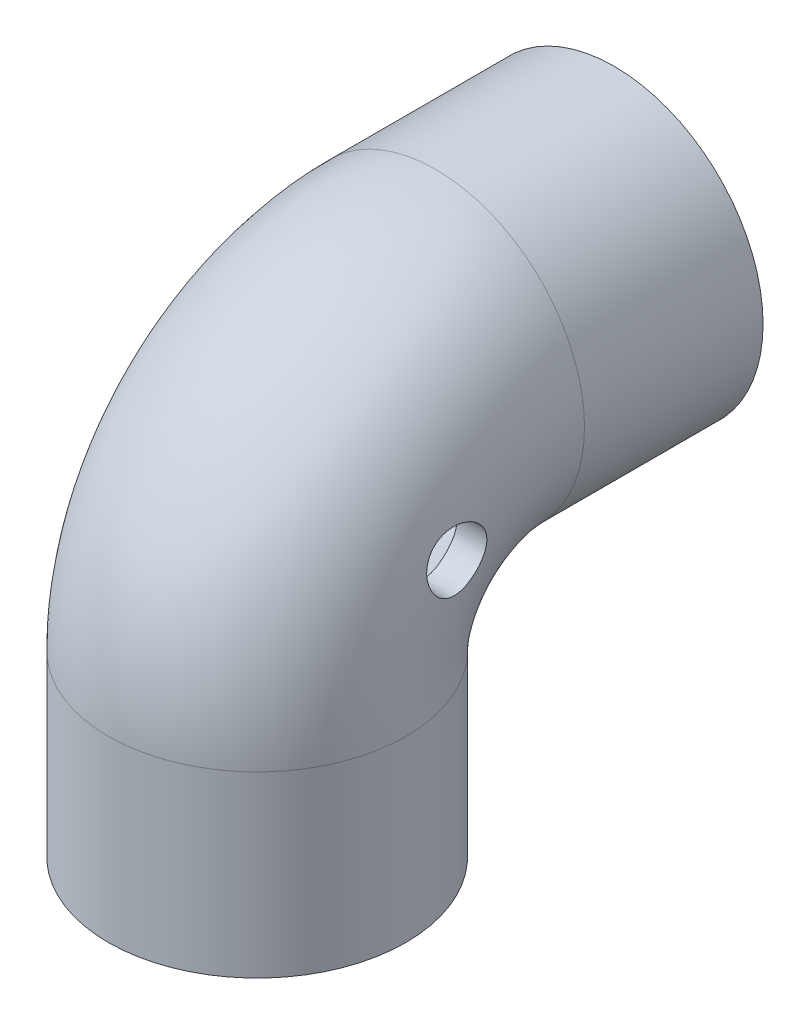
ISO-10303-21;
HEADER;
FILE_DESCRIPTION(('STEP AP214'),'2;1');
FILE_NAME('part.step','',(''),(''),'','','');
FILE_SCHEMA(('AUTOMOTIVE_DESIGN { 1 0 10303 214 1 1 1 1 }'));
ENDSEC;
DATA;
#1=APPLICATION_CONTEXT('core data for automotive mechanical design processes');
#2=APPLICATION_PROTOCOL_DEFINITION('international standard','automotive_design',2000,#1);
#3=PRODUCT_CONTEXT('',#1,'mechanical');
#4=PRODUCT('Part','Part','',(#3));
#5=PRODUCT_RELATED_PRODUCT_CATEGORY('part','',(#4));
#6=PRODUCT_DEFINITION_FORMATION('','',#4);
#7=PRODUCT_DEFINITION_CONTEXT('part definition',#1,'design');
#8=PRODUCT_DEFINITION('design','',#6,#7);
#9=PRODUCT_DEFINITION_SHAPE('','',#8);
#10=(LENGTH_UNIT() NAMED_UNIT(*) SI_UNIT(.MILLI.,.METRE.));
#11=(NAMED_UNIT(*) PLANE_ANGLE_UNIT() SI_UNIT($,.RADIAN.));
#12=(NAMED_UNIT(*) SI_UNIT($,.STERADIAN.) SOLID_ANGLE_UNIT());
#13=UNCERTAINTY_MEASURE_WITH_UNIT(LENGTH_MEASURE(1.E-05),#10,'distance_accuracy_value','');
#14=(GEOMETRIC_REPRESENTATION_CONTEXT(3) GLOBAL_UNCERTAINTY_ASSIGNED_CONTEXT((#13)) GLOBAL_UNIT_ASSIGNED_CONTEXT((#10,
#11,#12)) REPRESENTATION_CONTEXT('',''));
#15=CARTESIAN_POINT('',(0.,0.,0.));
#16=DIRECTION('',(0.,0.,1.));
#17=DIRECTION('',(1.,0.,0.));
#18=AXIS2_PLACEMENT_3D('',#15,#16,#17);
#19=CARTESIAN_POINT('',(0.,0.,0.));
#20=DIRECTION('',(0.,1.,0.));
#21=DIRECTION('',(0.,0.,1.));
#22=AXIS2_PLACEMENT_3D('',#19,#20,#21);
#23=CYLINDRICAL_SURFACE('',#22,12.5);
#24=CARTESIAN_POINT('',(0.,14.9999999999999,0.));
#25=DIRECTION('',(0.,1.,0.));
#26=DIRECTION('',(0.,0.,1.));
#27=AXIS2_PLACEMENT_3D('',#24,#25,#26);
#28=CIRCLE('',#27,12.5);
#29=CARTESIAN_POINT('',(0.,14.9999999999999,12.5));
#30=VERTEX_POINT('',#29);
#31=EDGE_CURVE('E98',#30,#30,#28,.T.);
#32=ORIENTED_EDGE('',*,*,#31,.F.);
#33=EDGE_LOOP('',(#32));
#34=FACE_BOUND('',#33,.T.);
#35=CARTESIAN_POINT('',(0.,0.,0.));
#36=DIRECTION('',(0.,1.,0.));
#37=DIRECTION('',(0.,0.,1.));
#38=AXIS2_PLACEMENT_3D('',#35,#36,#37);
#39=CIRCLE('',#38,12.5);
#40=CARTESIAN_POINT('',(0.,0.,12.5));
#41=VERTEX_POINT('',#40);
#42=EDGE_CURVE('E60',#41,#41,#39,.T.);
#43=ORIENTED_EDGE('',*,*,#42,.T.);
#44=EDGE_LOOP('',(#43));
#45=FACE_BOUND('',#44,.T.);
#46=ADVANCED_FACE('F39',(#34,#45),#23,.T.);
#47=CARTESIAN_POINT('',(0.,15.,-15.));
#48=DIRECTION('',(-1.,0.,0.));
#49=DIRECTION('',(0.,0.,1.));
#50=AXIS2_PLACEMENT_3D('',#47,#48,#49);
#51=TOROIDAL_SURFACE('',#50,15.,12.5);
#52=CARTESIAN_POINT('',(-12.2581101899307,24.2005987948516,-6.46055956779744));
#53=CARTESIAN_POINT('',(-12.2519989551284,24.0872564443121,-6.38346281613475));
#54=CARTESIAN_POINT('',(-12.2484072995002,23.9801301236395,-6.29692574651522));
#55=CARTESIAN_POINT('',(-12.246827231077,23.7814678897547,-6.1073865438133));
#56=CARTESIAN_POINT('',(-12.2488419440933,23.6899407039752,-6.00437525576514));
#57=CARTESIAN_POINT('',(-12.2581642308323,23.5251780884782,-5.7849734228435));
#58=CARTESIAN_POINT('',(-12.2654679786079,23.4519294879891,-5.66859260030849));
#59=CARTESIAN_POINT('',(-12.284281573022,23.3255703133315,-5.42569898460763));
#60=CARTESIAN_POINT('',(-12.295791624987,23.2724607224861,-5.29918569707134));
#61=CARTESIAN_POINT('',(-12.3215575667115,23.187169638438,-5.03794808341137));
#62=CARTESIAN_POINT('',(-12.3358433600957,23.1552344919274,-4.90314638539093));
#63=CARTESIAN_POINT('',(-12.3651823250947,23.1140164304523,-4.63019793242444));
#64=CARTESIAN_POINT('',(-12.3802355888781,23.104736242781,-4.49205077676052));
#65=CARTESIAN_POINT('',(-12.4095882393511,23.109136655336,-4.21287002350211));
#66=CARTESIAN_POINT('',(-12.423862955723,23.1233399975771,-4.07184162162759));
#67=CARTESIAN_POINT('',(-12.4495816570247,23.1754195734015,-3.79395467018972));
#68=CARTESIAN_POINT('',(-12.4610258135033,23.2132943718633,-3.65709586836491));
#69=CARTESIAN_POINT('',(-12.4797692125634,23.3113924408014,-3.39251530728248));
#70=CARTESIAN_POINT('',(-12.4870993636064,23.3714432818986,-3.26473189042581));
#71=CARTESIAN_POINT('',(-12.497075964825,23.5122747497966,-3.02095369314288));
#72=CARTESIAN_POINT('',(-12.4997229209075,23.5930531364039,-2.90495764065091));
#73=CARTESIAN_POINT('',(-12.5002310317648,23.7713444675723,-2.6901779076653));
#74=CARTESIAN_POINT('',(-12.4981779971313,23.8685278232916,-2.59112053278472));
#75=CARTESIAN_POINT('',(-12.48986205837,24.0778131347799,-2.41049313604261));
#76=CARTESIAN_POINT('',(-12.4835991229882,24.1899152012991,-2.32892324401267));
#77=CARTESIAN_POINT('',(-12.4676451305118,24.4259678480387,-2.18541187124388));
#78=CARTESIAN_POINT('',(-12.457950694703,24.5499300178219,-2.12348985050511));
#79=CARTESIAN_POINT('',(-12.4361990832853,24.8061867243613,-2.02097658627402));
#80=CARTESIAN_POINT('',(-12.4241416995331,24.938481994452,-1.98038722305585));
#81=CARTESIAN_POINT('',(-12.3986843239258,25.2099554209202,-1.92109687172782));
#82=CARTESIAN_POINT('',(-12.3852662861156,25.3492088561781,-1.90274807238418));
#83=CARTESIAN_POINT('',(-12.3585748733803,25.6288433732346,-1.88958116201454));
#84=CARTESIAN_POINT('',(-12.3453015072957,25.7692245230445,-1.89476448098239));
#85=CARTESIAN_POINT('',(-12.3200689326102,26.0484491313515,-1.92870486317401));
#86=CARTESIAN_POINT('',(-12.3081217256579,26.1872697016186,-1.95765997971657));
#87=CARTESIAN_POINT('',(-12.2868293987561,26.4582121552308,-2.03866912061499));
#88=CARTESIAN_POINT('',(-12.2774841430479,26.5903343877724,-2.09072193946334));
#89=CARTESIAN_POINT('',(-12.262365998045,26.8429878248901,-2.21599940234047));
#90=CARTESIAN_POINT('',(-12.2565641722227,26.9636059396671,-2.28904518770332));
#91=CARTESIAN_POINT('',(-12.2489717049634,27.1909412990007,-2.45442395577898));
#92=CARTESIAN_POINT('',(-12.2471807205548,27.2976597313995,-2.54675528862496));
#93=CARTESIAN_POINT('',(-12.2477783605831,27.4928210816609,-2.74674918244927));
#94=CARTESIAN_POINT('',(-12.2501145369752,27.5814775896463,-2.8542036153856));
#95=CARTESIAN_POINT('',(-12.2586437490525,27.7396882779637,-3.08221671820724));
#96=CARTESIAN_POINT('',(-12.2648367670207,27.8092425460421,-3.2027753278949));
#97=CARTESIAN_POINT('',(-12.2804980099498,27.9273600407524,-3.45356116439516));
#98=CARTESIAN_POINT('',(-12.2899661735906,27.9759236603501,-3.58378821015156));
#99=CARTESIAN_POINT('',(-12.3112962861182,28.0508204126039,-3.85029754515056));
#100=CARTESIAN_POINT('',(-12.3231584167023,28.077151857095,-3.98658029339637));
#101=CARTESIAN_POINT('',(-12.348332333701,28.1071330630007,-4.26323222420341));
#102=CARTESIAN_POINT('',(-12.3616604403631,28.110494115597,-4.40363122397081));
#103=CARTESIAN_POINT('',(-12.3883608763945,28.0937099945647,-4.68301908277466));
#104=CARTESIAN_POINT('',(-12.4017332086696,28.0735632444196,-4.82200784660513));
#105=CARTESIAN_POINT('',(-12.4273061183095,28.010005982461,-5.09595557768885));
#106=CARTESIAN_POINT('',(-12.4394956293118,27.9663968882208,-5.2308696079255));
#107=CARTESIAN_POINT('',(-12.4612705760058,27.8569312904844,-5.49157926339307));
#108=CARTESIAN_POINT('',(-12.470856137585,27.7910758628276,-5.61737532921422));
#109=CARTESIAN_POINT('',(-12.4862439499797,27.6395289304712,-5.85522225420125));
#110=CARTESIAN_POINT('',(-12.4920761367247,27.5540019580278,-5.96737593792962));
#111=CARTESIAN_POINT('',(-12.4992964977566,27.3652429902629,-6.17579609822427));
#112=CARTESIAN_POINT('',(-12.5006851988039,27.2620130950922,-6.2720644566591));
#113=CARTESIAN_POINT('',(-12.498690790622,27.0426180628081,-6.44450047499283));
#114=CARTESIAN_POINT('',(-12.4953822458685,26.9266814177113,-6.5209599482224));
#115=CARTESIAN_POINT('',(-12.4843028663554,26.6839391637287,-6.65359128444208));
#116=CARTESIAN_POINT('',(-12.4765321941536,26.5571339509337,-6.7097638863722));
#117=CARTESIAN_POINT('',(-12.4572469154054,26.2963918664718,-6.8003093473101));
#118=CARTESIAN_POINT('',(-12.4457360341773,26.162462201439,-6.83470379766434));
#119=CARTESIAN_POINT('',(-12.4201669835457,25.8909792964153,-6.88098716627617));
#120=CARTESIAN_POINT('',(-12.406108080842,25.7534250230557,-6.8928695944487));
#121=CARTESIAN_POINT('',(-12.3767736469836,25.475794609519,-6.89390198176145));
#122=CARTESIAN_POINT('',(-12.361480436113,25.3357188329453,-6.88262786390145));
#123=CARTESIAN_POINT('',(-12.3318646402496,25.0593914628675,-6.83678703588792));
#124=CARTESIAN_POINT('',(-12.3175413873502,24.9231372765067,-6.80223653693211));
#125=CARTESIAN_POINT('',(-12.2945752283004,24.6865045484315,-6.72053729532606));
#126=CARTESIAN_POINT('',(-12.2853725927308,24.5846843612889,-6.67766177742017));
#127=CARTESIAN_POINT('',(-12.2696040878702,24.3874288074545,-6.5787560702711));
#128=CARTESIAN_POINT('',(-12.2630380135264,24.2919929447171,-6.52272690456133));
#129=CARTESIAN_POINT('',(-12.2581101899307,24.2005987948516,-6.46055956779744));
#130=B_SPLINE_CURVE_WITH_KNOTS('',3,(#52,#53,#54,#55,#56,#57,#58,#59,#60,#61,#62,#63,#64,#65,
#66,#67,#68,#69,#70,#71,#72,#73,#74,#75,#76,#77,#78,#79,#80,#81,#82,#83,#84,#85,#86,#87,#88,#89,
#90,#91,#92,#93,#94,#95,#96,#97,#98,#99,#100,#101,#102,#103,#104,#105,#106,#107,#108,#109,#110,
#111,#112,#113,#114,#115,#116,#117,#118,#119,#120,#121,#122,#123,#124,#125,#126,#127,#128,#129),
.UNSPECIFIED.,.T.,.F.,(4,2,2,2,2,2,2,2,2,2,2,2,2,2,2,2,2,2,2,2,2,2,2,2,2,2,2,2,2,2,2,2,2,2,2,2,
2,2,4),(0.,0.411245631472301,0.822720597433928,1.2338982102918,1.64509589704399,
2.06099728815307,2.4769487446409,2.90228448328274,3.32759443773837,3.74966473908137,
4.17168944307099,4.5860705725888,5.00045477847269,5.41524813432824,5.83007804420811,
6.25139456887402,6.67273669633903,7.097625266415,7.52249166345766,7.94384041170802,
8.36515312858276,8.78115024231854,9.19714544513765,9.61313285977634,10.0291518589179,
10.4503902288095,10.871656850062,11.2965464401759,11.7214154854437,12.1428524570568,
12.5642394668821,12.9790116493408,13.3937687223883,13.8081139494901,14.2225786117446,
14.644701203673,15.0665301052716,15.3981657967389,15.7297756909699),.UNSPECIFIED.);
#131=CARTESIAN_POINT('',(-12.2581101899307,24.2005987948516,-6.46055956779744));
#132=VERTEX_POINT('',#131);
#133=EDGE_CURVE('E102',#132,#132,#130,.T.);
#134=ORIENTED_EDGE('',*,*,#133,.F.);
#135=EDGE_LOOP('',(#134));
#136=FACE_BOUND('',#135,.T.);
#137=CARTESIAN_POINT('',(12.2581101899307,24.2005987948516,-6.46055956779744));
#138=CARTESIAN_POINT('',(12.2643686498743,24.3165426044212,-6.53941359506477));
#139=CARTESIAN_POINT('',(12.2732681758052,24.4390988338685,-6.60846278404322));
#140=CARTESIAN_POINT('',(12.2950115251153,24.6938223740386,-6.72502773579231));
#141=CARTESIAN_POINT('',(12.3078594914447,24.8259996680828,-6.77252075021341));
#142=CARTESIAN_POINT('',(12.335637775656,25.0960505582022,-6.84469230064229));
#143=CARTESIAN_POINT('',(12.3505654731649,25.2339168349015,-6.86939925218764));
#144=CARTESIAN_POINT('',(12.3805424334023,25.5117981178714,-6.89549479197937));
#145=CARTESIAN_POINT('',(12.3955916760603,25.6518127726885,-6.89688715439996));
#146=CARTESIAN_POINT('',(12.4241501834623,25.9320275229678,-6.87615360569057));
#147=CARTESIAN_POINT('',(12.437638084471,26.0722084681393,-6.85373641981438));
#148=CARTESIAN_POINT('',(12.4612909009408,26.3470286919068,-6.78542891213691));
#149=CARTESIAN_POINT('',(12.4714560461836,26.4816683531415,-6.7395402140469));
#150=CARTESIAN_POINT('',(12.4873054629083,26.7398760418314,-6.62618303143762));
#151=CARTESIAN_POINT('',(12.4930424174863,26.8635582363688,-6.55898212802883));
#152=CARTESIAN_POINT('',(12.4997692052568,27.097990432926,-6.40472698957939));
#153=CARTESIAN_POINT('',(12.5007594619617,27.208741587826,-6.31767452647171));
#154=CARTESIAN_POINT('',(12.4981039709939,27.412383489964,-6.12782058822529));
#155=CARTESIAN_POINT('',(12.4945327978025,27.5055336762998,-6.02529600882886));
#156=CARTESIAN_POINT('',(12.483427143156,27.67357232761,-5.80643352999652));
#157=CARTESIAN_POINT('',(12.4758925681656,27.7484603615409,-5.69009530461194));
#158=CARTESIAN_POINT('',(12.4577098100599,27.8782909470447,-5.44629603687873));
#159=CARTESIAN_POINT('',(12.4470470257333,27.9331371930491,-5.31878484672022));
#160=CARTESIAN_POINT('',(12.423759028397,28.0209875956029,-5.05661636481618));
#161=CARTESIAN_POINT('',(12.4111336312434,28.0539897010787,-4.92195840330055));
#162=CARTESIAN_POINT('',(12.3849675721541,28.097668394093,-4.64693173115303));
#163=CARTESIAN_POINT('',(12.3714155384369,28.1079811665387,-4.50650623223076));
#164=CARTESIAN_POINT('',(12.3449097400762,28.1049258907248,-4.22585049750652));
#165=CARTESIAN_POINT('',(12.3319560013544,28.0915568174132,-4.08562027041967));
#166=CARTESIAN_POINT('',(12.3078243550999,28.0413062266209,-3.80845577934071));
#167=CARTESIAN_POINT('',(12.2966567324733,28.0042942613529,-3.67154420333646));
#168=CARTESIAN_POINT('',(12.2772671822193,27.9075919351412,-3.40575526749597));
#169=CARTESIAN_POINT('',(12.2690450550696,27.8479031108514,-3.27687736396201));
#170=CARTESIAN_POINT('',(12.2564120521089,27.7082202755893,-3.03220887494044));
#171=CARTESIAN_POINT('',(12.2519625307214,27.6284432900619,-2.91629641283634));
#172=CARTESIAN_POINT('',(12.247159419108,27.4505485114259,-2.69943088227683));
#173=CARTESIAN_POINT('',(12.2468055133725,27.3524321317006,-2.59847666209137));
#174=CARTESIAN_POINT('',(12.250207076229,27.1419234250142,-2.41551680096638));
#175=CARTESIAN_POINT('',(12.2539158516131,27.0297061616314,-2.3333087033089));
#176=CARTESIAN_POINT('',(12.2650190184875,26.7933478678545,-2.18866900472864));
#177=CARTESIAN_POINT('',(12.2724134559095,26.6692066888764,-2.12623765028527));
#178=CARTESIAN_POINT('',(12.2902221016209,26.4121483117915,-2.02267039826396));
#179=CARTESIAN_POINT('',(12.3006446057404,26.2792077897584,-1.98159387950999));
#180=CARTESIAN_POINT('',(12.3235300994013,26.0085278708202,-1.92202948521058));
#181=CARTESIAN_POINT('',(12.3359932569089,25.8707880796223,-1.90354347015197));
#182=CARTESIAN_POINT('',(12.3619685277821,25.5923933386633,-1.88950556911765));
#183=CARTESIAN_POINT('',(12.3754923537714,25.451723947062,-1.89426087170151));
#184=CARTESIAN_POINT('',(12.402125020585,25.1731231657349,-1.92727267473431));
#185=CARTESIAN_POINT('',(12.4152338389455,25.0351919243722,-1.95553044509415));
#186=CARTESIAN_POINT('',(12.4397853940513,24.7650353242599,-2.03506981270712));
#187=CARTESIAN_POINT('',(12.4512173652723,24.6328503680522,-2.08649222700462));
#188=CARTESIAN_POINT('',(12.4710658594844,24.3788825601438,-2.21103628952985));
#189=CARTESIAN_POINT('',(12.4794826018122,24.2570989523092,-2.28415635869814));
#190=CARTESIAN_POINT('',(12.4922096552097,24.0287436835542,-2.44917735792041));
#191=CARTESIAN_POINT('',(12.4965629766716,23.922023084768,-2.5408687787804));
#192=CARTESIAN_POINT('',(12.5006776577557,23.725415940394,-2.74088510824195));
#193=CARTESIAN_POINT('',(12.5004395237854,23.6355275394288,-2.84920818117345));
#194=CARTESIAN_POINT('',(12.4952419925927,23.4763958186831,-3.07760483899478));
#195=CARTESIAN_POINT('',(12.4903520198979,23.4068685525178,-3.19748237700571));
#196=CARTESIAN_POINT('',(12.4763095997402,23.2886084346705,-3.44685118014153));
#197=CARTESIAN_POINT('',(12.4671570933182,23.2398758706374,-3.57634257822394));
#198=CARTESIAN_POINT('',(12.4454389581195,23.1643219048852,-3.84170829976873));
#199=CARTESIAN_POINT('',(12.4328630615607,23.1375674078629,-3.97760079140215));
#200=CARTESIAN_POINT('',(12.4056709240321,23.10680897051,-4.25173933805499));
#201=CARTESIAN_POINT('',(12.3910544204043,23.1028079616815,-4.38998569403914));
#202=CARTESIAN_POINT('',(12.3612107278421,23.117746857399,-4.66785830445278));
#203=CARTESIAN_POINT('',(12.3459772053926,23.1371271377272,-4.80746035534308));
#204=CARTESIAN_POINT('',(12.3171683819845,23.1990949365968,-5.08163054419689));
#205=CARTESIAN_POINT('',(12.3035933778005,23.2416866011485,-5.21619777825268));
#206=CARTESIAN_POINT('',(12.2799931857868,23.3492046251202,-5.47696445610864));
#207=CARTESIAN_POINT('',(12.2699798400872,23.4142041034334,-5.60313487186905));
#208=CARTESIAN_POINT('',(12.2551185437112,23.564734178376,-5.8427966424407));
#209=CARTESIAN_POINT('',(12.2502651161258,23.65024288739,-5.95630132627391));
#210=CARTESIAN_POINT('',(12.2470078982554,23.8122663345451,-6.13713994013638));
#211=CARTESIAN_POINT('',(12.2471611477967,23.8844093329526,-6.20841797070121));
#212=CARTESIAN_POINT('',(12.2504548572531,24.0367541216738,-6.34168468857644));
#213=CARTESIAN_POINT('',(12.2535952759381,24.1169558007447,-6.40367350408673));
#214=CARTESIAN_POINT('',(12.2581101899307,24.2005987948516,-6.46055956779744));
#215=B_SPLINE_CURVE_WITH_KNOTS('',3,(#137,#138,#139,#140,#141,#142,#143,#144,#145,#146,#147,
#148,#149,#150,#151,#152,#153,#154,#155,#156,#157,#158,#159,#160,#161,#162,#163,#164,#165,#166,
#167,#168,#169,#170,#171,#172,#173,#174,#175,#176,#177,#178,#179,#180,#181,#182,#183,#184,#185,
#186,#187,#188,#189,#190,#191,#192,#193,#194,#195,#196,#197,#198,#199,#200,#201,#202,#203,#204,
#205,#206,#207,#208,#209,#210,#211,#212,#213,#214),.UNSPECIFIED.,.T.,.F.,(4,2,2,2,2,2,2,2,2,2,2,
2,2,2,2,2,2,2,2,2,2,2,2,2,2,2,2,2,2,2,2,2,2,2,2,2,2,2,4),(0.,0.420693444069681,
0.841829821853088,1.26244030526662,1.68298269944318,2.1087297143453,2.53444728092103,
2.95501840941304,3.37555201277491,3.78929753406096,4.20305282008315,4.61877093724319,
5.03452808306407,5.45690459099779,5.87929938164773,6.30404507167773,6.72876198476375,
7.14907375726185,7.56935315045085,7.98485239155624,8.40035681086416,8.81701047590562,
9.23369845299396,9.65590871803436,10.0781417978811,10.5029769978214,10.9277812877128,
11.3480363620511,11.7682450852617,12.1822793620122,12.5963193658302,13.0116151501133,
13.4269644388478,13.850260293132,14.2736317811835,14.6983980573761,15.1227130209656,
15.4262095601387,15.7297019103885),.UNSPECIFIED.);
#216=CARTESIAN_POINT('',(12.2581101899307,24.2005987948516,-6.46055956779744));
#217=VERTEX_POINT('',#216);
#218=EDGE_CURVE('E123',#217,#217,#215,.T.);
#219=ORIENTED_EDGE('',*,*,#218,.F.);
#220=EDGE_LOOP('',(#219));
#221=FACE_BOUND('',#220,.T.);
#222=CARTESIAN_POINT('',(0.,30.,-15.0000000000001));
#223=DIRECTION('',(0.,0.,-1.));
#224=DIRECTION('',(0.,1.,0.));
#225=AXIS2_PLACEMENT_3D('',#222,#223,#224);
#226=CIRCLE('',#225,12.5);
#227=CARTESIAN_POINT('',(0.,42.5,-15.0000000000002));
#228=VERTEX_POINT('',#227);
#229=EDGE_CURVE('E97',#228,#228,#226,.T.);
#230=ORIENTED_EDGE('',*,*,#229,.F.);
#231=EDGE_LOOP('',(#230));
#232=FACE_BOUND('',#231,.T.);
#233=ORIENTED_EDGE('',*,*,#31,.T.);
#234=EDGE_LOOP('',(#233));
#235=FACE_BOUND('',#234,.T.);
#236=ADVANCED_FACE('F132',(#136,#221,#232,#235),#51,.T.);
#237=CARTESIAN_POINT('',(0.,30.,-15.0000000000001));
#238=DIRECTION('',(0.,0.,-1.));
#239=DIRECTION('',(-1.,0.,0.));
#240=AXIS2_PLACEMENT_3D('',#237,#238,#239);
#241=CYLINDRICAL_SURFACE('',#240,12.5);
#242=CARTESIAN_POINT('',(0.,30.,-30.));
#243=DIRECTION('',(0.,0.,-1.));
#244=DIRECTION('',(0.,1.,0.));
#245=AXIS2_PLACEMENT_3D('',#242,#243,#244);
#246=CIRCLE('',#245,12.5);
#247=CARTESIAN_POINT('',(0.,42.5,-30.));
#248=VERTEX_POINT('',#247);
#249=EDGE_CURVE('E65',#248,#248,#246,.T.);
#250=ORIENTED_EDGE('',*,*,#249,.F.);
#251=EDGE_LOOP('',(#250));
#252=FACE_BOUND('',#251,.T.);
#253=ORIENTED_EDGE('',*,*,#229,.T.);
#254=EDGE_LOOP('',(#253));
#255=FACE_BOUND('',#254,.T.);
#256=ADVANCED_FACE('F41',(#252,#255),#241,.T.);
#257=CARTESIAN_POINT('',(0.,0.,0.));
#258=DIRECTION('',(0.,1.,0.));
#259=DIRECTION('',(0.,0.,1.));
#260=AXIS2_PLACEMENT_3D('',#257,#258,#259);
#261=PLANE('',#260);
#262=CARTESIAN_POINT('',(0.,0.,0.));
#263=DIRECTION('',(0.,1.,0.));
#264=DIRECTION('',(0.,0.,1.));
#265=AXIS2_PLACEMENT_3D('',#262,#263,#264);
#266=CIRCLE('',#265,10.);
#267=CARTESIAN_POINT('',(0.,0.,10.));
#268=VERTEX_POINT('',#267);
#269=EDGE_CURVE('E89',#268,#268,#266,.F.);
#270=ORIENTED_EDGE('',*,*,#269,.F.);
#271=EDGE_LOOP('',(#270));
#272=FACE_BOUND('',#271,.T.);
#273=ORIENTED_EDGE('',*,*,#42,.F.);
#274=EDGE_LOOP('',(#273));
#275=FACE_BOUND('',#274,.T.);
#276=ADVANCED_FACE('F141',(#272,#275),#261,.F.);
#277=CARTESIAN_POINT('',(0.,30.,-30.));
#278=DIRECTION('',(0.,0.,-1.));
#279=DIRECTION('',(0.,1.,0.));
#280=AXIS2_PLACEMENT_3D('',#277,#278,#279);
#281=PLANE('',#280);
#282=CARTESIAN_POINT('',(0.,30.,-30.));
#283=DIRECTION('',(0.,0.,-1.));
#284=DIRECTION('',(0.,1.,0.));
#285=AXIS2_PLACEMENT_3D('',#282,#283,#284);
#286=CIRCLE('',#285,10.);
#287=CARTESIAN_POINT('',(0.,40.,-30.));
#288=VERTEX_POINT('',#287);
#289=EDGE_CURVE('E11',#288,#288,#286,.F.);
#290=ORIENTED_EDGE('',*,*,#289,.T.);
#291=EDGE_LOOP('',(#290));
#292=FACE_BOUND('',#291,.T.);
#293=ORIENTED_EDGE('',*,*,#249,.T.);
#294=EDGE_LOOP('',(#293));
#295=FACE_BOUND('',#294,.T.);
#296=ADVANCED_FACE('F72',(#292,#295),#281,.T.);
#297=CARTESIAN_POINT('',(0.,0.,0.));
#298=DIRECTION('',(0.,1.,0.));
#299=DIRECTION('',(0.,0.,1.));
#300=AXIS2_PLACEMENT_3D('',#297,#298,#299);
#301=CYLINDRICAL_SURFACE('',#300,10.);
#302=CARTESIAN_POINT('',(0.,14.9999999999999,0.));
#303=DIRECTION('',(0.,1.,0.));
#304=DIRECTION('',(0.,0.,1.));
#305=AXIS2_PLACEMENT_3D('',#302,#303,#304);
#306=CIRCLE('',#305,10.);
#307=CARTESIAN_POINT('',(0.,14.9999999999999,10.));
#308=VERTEX_POINT('',#307);
#309=EDGE_CURVE('E85',#308,#308,#306,.F.);
#310=ORIENTED_EDGE('',*,*,#309,.F.);
#311=EDGE_LOOP('',(#310));
#312=FACE_BOUND('',#311,.T.);
#313=ORIENTED_EDGE('',*,*,#269,.T.);
#314=EDGE_LOOP('',(#313));
#315=FACE_BOUND('',#314,.T.);
#316=ADVANCED_FACE('F117',(#312,#315),#301,.F.);
#317=CARTESIAN_POINT('',(0.,15.,-15.));
#318=DIRECTION('',(-1.,0.,0.));
#319=DIRECTION('',(0.,0.,1.));
#320=AXIS2_PLACEMENT_3D('',#317,#318,#319);
#321=TOROIDAL_SURFACE('',#320,15.,10.);
#322=CARTESIAN_POINT('',(-9.69627945701115,24.2055404488117,-6.46391206398295));
#323=CARTESIAN_POINT('',(-9.70428017657025,24.3216095937788,-6.54244762499847));
#324=CARTESIAN_POINT('',(-9.71560005250489,24.4441871844457,-6.61112113259195));
#325=CARTESIAN_POINT('',(-9.74313160486941,24.6986944672998,-6.72691348062399));
#326=CARTESIAN_POINT('',(-9.75934802459093,24.8306331323416,-6.77401130880158));
#327=CARTESIAN_POINT('',(-9.79430313165364,25.0999554249934,-6.84547592825018));
#328=CARTESIAN_POINT('',(-9.81303754596242,25.2373295558673,-6.86988068584718));
#329=CARTESIAN_POINT('',(-9.85060049755039,25.5141877284256,-6.89555483890716));
#330=CARTESIAN_POINT('',(-9.86942902305953,25.6536715104778,-6.89682705844553));
#331=CARTESIAN_POINT('',(-9.90525977805311,25.9338724834001,-6.87593741558947));
#332=CARTESIAN_POINT('',(-9.92222006545143,26.0745620394391,-6.85332573712643));
#333=CARTESIAN_POINT('',(-9.95192200603214,26.3504795951778,-6.78439323253837));
#334=CARTESIAN_POINT('',(-9.96466421650207,26.4857083142826,-6.7380755404854));
#335=CARTESIAN_POINT('',(-9.98440060335169,26.7441411684684,-6.62399656208432));
#336=CARTESIAN_POINT('',(-9.99150040926212,26.8675262788069,-6.55666391082538));
#337=CARTESIAN_POINT('',(-9.99977647384596,27.101406089178,-6.40217748230384));
#338=CARTESIAN_POINT('',(-10.0009535366847,27.2119025371892,-6.31502639758498));
#339=CARTESIAN_POINT('',(-9.99754529823393,27.4141411390266,-6.12588198515579));
#340=CARTESIAN_POINT('',(-9.99310170406814,27.5062793321802,-6.02430874924347));
#341=CARTESIAN_POINT('',(-9.97935915968025,27.6726115611906,-5.80770094192374));
#342=CARTESIAN_POINT('',(-9.97006003885433,27.7468049664052,-5.69266589763235));
#343=CARTESIAN_POINT('',(-9.94760267860502,27.875816609158,-5.45146660024571));
#344=CARTESIAN_POINT('',(-9.93441664504198,27.9304888050332,-5.32522693444227));
#345=CARTESIAN_POINT('',(-9.90558739926463,28.0183869398614,-5.06575408962059));
#346=CARTESIAN_POINT('',(-9.88994384277636,28.0516098706535,-4.9325199324891));
#347=CARTESIAN_POINT('',(-9.85731694941879,28.0963797865842,-4.65919658929038));
#348=CARTESIAN_POINT('',(-9.84031012484617,28.1073736033979,-4.51901939962506));
#349=CARTESIAN_POINT('',(-9.80696166961605,28.1057453592433,-4.23871305045548));
#350=CARTESIAN_POINT('',(-9.79062008911232,28.0931215210609,-4.09858389535942));
#351=CARTESIAN_POINT('',(-9.76003128966105,28.0442835430371,-3.8208950115789));
#352=CARTESIAN_POINT('',(-9.74580478118807,28.0078528636816,-3.68337090944824));
#353=CARTESIAN_POINT('',(-9.72103470460708,27.9120742671497,-3.41619358496904));
#354=CARTESIAN_POINT('',(-9.71049073267779,27.8527288642703,-3.28653950089549));
#355=CARTESIAN_POINT('',(-9.6942760168782,27.7138413748183,-3.04094767864973));
#356=CARTESIAN_POINT('',(-9.68853002635619,27.6346375022199,-2.92482372468643));
#357=CARTESIAN_POINT('',(-9.682201264054,27.4578266609974,-2.70739898443083));
#358=CARTESIAN_POINT('',(-9.68161785073026,27.3602219805461,-2.60609635785936));
#359=CARTESIAN_POINT('',(-9.68563306981966,27.1514289016683,-2.42300798207978));
#360=CARTESIAN_POINT('',(-9.69013709321292,27.0405216822314,-2.34089908208256));
#361=CARTESIAN_POINT('',(-9.70374040627378,26.8069393864083,-2.19611081439928));
#362=CARTESIAN_POINT('',(-9.71283978510513,26.6842640817232,-2.13343182375017));
#363=CARTESIAN_POINT('',(-9.73481839439883,26.4300861147212,-2.02890354813708));
#364=CARTESIAN_POINT('',(-9.74771273122311,26.2985498253794,-1.98713934769968));
#365=CARTESIAN_POINT('',(-9.77606484315254,26.0306676306689,-1.92579707226324));
#366=CARTESIAN_POINT('',(-9.79152293761664,25.8943211277755,-1.90622176364514));
#367=CARTESIAN_POINT('',(-9.82391516994166,25.6175247628411,-1.88950068168032));
#368=CARTESIAN_POINT('',(-9.84087342884675,25.4770487443775,-1.89283290864712));
#369=CARTESIAN_POINT('',(-9.87434296561011,25.1985677633824,-1.92294763330302));
#370=CARTESIAN_POINT('',(-9.89085420341503,25.0605630226514,-1.9497322252162));
#371=CARTESIAN_POINT('',(-9.92193938526897,24.7893788703565,-2.02650097092507));
#372=CARTESIAN_POINT('',(-9.93649191237831,24.6562628293146,-2.07671836295963));
#373=CARTESIAN_POINT('',(-9.96187299347478,24.4001785661503,-2.1991606114623));
#374=CARTESIAN_POINT('',(-9.97270196228946,24.2772092147846,-2.27138301474347));
#375=CARTESIAN_POINT('',(-9.98918942629199,24.0469750427419,-2.4345345382188));
#376=CARTESIAN_POINT('',(-9.99492870922224,23.939488401755,-2.52514223178543));
#377=CARTESIAN_POINT('',(-10.0007040091141,23.7411398917009,-2.72316413656069));
#378=CARTESIAN_POINT('',(-10.0007410114915,23.6502751529002,-2.83057544071247));
#379=CARTESIAN_POINT('',(-9.99493502992413,23.4897497540904,-3.05635444185489));
#380=CARTESIAN_POINT('',(-9.98922693774378,23.4196504189357,-3.17441420888068));
#381=CARTESIAN_POINT('',(-9.97253284970401,23.2997965863423,-3.42008831841386));
#382=CARTESIAN_POINT('',(-9.96154679485497,23.2500423163035,-3.54770276769655));
#383=CARTESIAN_POINT('',(-9.93527757762827,23.1719297442999,-3.80937278403352));
#384=CARTESIAN_POINT('',(-9.91997940575392,23.143647474657,-3.94344946863305));
#385=CARTESIAN_POINT('',(-9.88669977488807,23.1093093513678,-4.21409867443948));
#386=CARTESIAN_POINT('',(-9.86871776307973,23.103258083452,-4.35067170474531));
#387=CARTESIAN_POINT('',(-9.8315575667892,23.113584865076,-4.62690705764853));
#388=CARTESIAN_POINT('',(-9.81235975894451,23.1306273731791,-4.76654219920214));
#389=CARTESIAN_POINT('',(-9.77574411621421,23.1879284219839,-5.04124627303872));
#390=CARTESIAN_POINT('',(-9.75832660672143,23.2281911978536,-5.17631436757458));
#391=CARTESIAN_POINT('',(-9.72762311087869,23.331432885586,-5.43919767684064));
#392=CARTESIAN_POINT('',(-9.7143692822306,23.3945808676263,-5.56695049260722));
#393=CARTESIAN_POINT('',(-9.69427891848813,23.5419088006563,-5.81015868371657));
#394=CARTESIAN_POINT('',(-9.68743585530591,23.626067245797,-5.92562646244774));
#395=CARTESIAN_POINT('',(-9.68200371430887,23.7906748948562,-6.11509192922191));
#396=CARTESIAN_POINT('',(-9.68184199096826,23.8672701752807,-6.19243014773958));
#397=CARTESIAN_POINT('',(-9.68588407841098,24.029791209736,-6.33645165091353));
#398=CARTESIAN_POINT('',(-9.69008786361886,24.1157169091017,-6.40313499798898));
#399=CARTESIAN_POINT('',(-9.69627945701115,24.2055404488117,-6.46391206398295));
#400=B_SPLINE_CURVE_WITH_KNOTS('',3,(#322,#323,#324,#325,#326,#327,#328,#329,#330,#331,#332,
#333,#334,#335,#336,#337,#338,#339,#340,#341,#342,#343,#344,#345,#346,#347,#348,#349,#350,#351,
#352,#353,#354,#355,#356,#357,#358,#359,#360,#361,#362,#363,#364,#365,#366,#367,#368,#369,#370,
#371,#372,#373,#374,#375,#376,#377,#378,#379,#380,#381,#382,#383,#384,#385,#386,#387,#388,#389,
#390,#391,#392,#393,#394,#395,#396,#397,#398,#399),.UNSPECIFIED.,.T.,.F.,(4,2,2,2,2,2,2,2,2,2,2,
2,2,2,2,2,2,2,2,2,2,2,2,2,2,2,2,2,2,2,2,2,2,2,2,2,2,2,4),(0.,0.420700313399786,
0.841809474624216,1.26221283068737,1.68256486256209,2.1109771406578,2.53933279479838,
2.95946690675541,3.37954397311687,3.78923815129226,4.19894672545368,4.61165917132075,
5.02442948564557,5.44735102569228,5.87030439160744,6.29715938059774,6.72396754661904,
7.14394920405534,7.56387867044389,7.97612562768346,8.38838058406564,8.80229930170601,
9.21626961863091,9.63890388708568,10.0615758993306,10.4885477731984,10.9154720643227,
11.335491871703,11.7554390950438,12.1657509894848,12.5760674699203,12.9878301896594,
13.3996778415548,13.8236303106274,14.2476601292817,14.6748886578114,15.1016816647758,
15.4272549487344,15.7528263253256),.UNSPECIFIED.);
#401=CARTESIAN_POINT('',(-9.69627945701115,24.2055404488117,-6.46391206398295));
#402=VERTEX_POINT('',#401);
#403=EDGE_CURVE('E43',#402,#402,#400,.T.);
#404=ORIENTED_EDGE('',*,*,#403,.F.);
#405=EDGE_LOOP('',(#404));
#406=FACE_BOUND('',#405,.T.);
#407=CARTESIAN_POINT('',(9.69627945701115,24.2055404488117,-6.46391206398295));
#408=CARTESIAN_POINT('',(9.6885683148615,24.093583207987,-6.38814994476893));
#409=CARTESIAN_POINT('',(9.6839426978006,23.9876140430434,-6.30316585286615));
#410=CARTESIAN_POINT('',(9.68158536534419,23.7907805412326,-6.11709849829561));
#411=CARTESIAN_POINT('',(9.68385512151377,23.6999194329918,-6.0160118034788));
#412=CARTESIAN_POINT('',(9.69493133049184,23.535969675136,-5.80079643565347));
#413=CARTESIAN_POINT('',(9.7037324117026,23.4628664863079,-5.68667854519224));
#414=CARTESIAN_POINT('',(9.72655393531641,23.3361785097304,-5.44856543715067));
#415=CARTESIAN_POINT('',(9.74057540630254,23.2825975726057,-5.32456827682638));
#416=CARTESIAN_POINT('',(9.77216304207814,23.195407921211,-5.06781405887218));
#417=CARTESIAN_POINT('',(9.78978505318992,23.1621516553985,-4.93494445467402));
#418=CARTESIAN_POINT('',(9.82612089882827,23.1177312630748,-4.66570017760073));
#419=CARTESIAN_POINT('',(9.84483492172291,23.1065709597032,-4.52932490229341));
#420=CARTESIAN_POINT('',(9.88177003519477,23.1066337123839,-4.25143278779984));
#421=CARTESIAN_POINT('',(9.89994843052708,23.118685774164,-4.10990937703973));
#422=CARTESIAN_POINT('',(9.93289480744272,23.1666663777209,-3.83055289946255));
#423=CARTESIAN_POINT('',(9.9476630771619,23.2025929012486,-3.69271952172973));
#424=CARTESIAN_POINT('',(9.97204277531368,23.2970220071756,-3.42611858756539));
#425=CARTESIAN_POINT('',(9.98170560368611,23.355288959393,-3.29727246690472));
#426=CARTESIAN_POINT('',(9.99519293752234,23.4928603770054,-3.05101990151297));
#427=CARTESIAN_POINT('',(9.99901845340721,23.5721611987113,-2.93361148024546));
#428=CARTESIAN_POINT('',(10.0006249541751,23.7469213908096,-2.71697102314791));
#429=CARTESIAN_POINT('',(9.99857482817193,23.8418567982633,-2.61731686314879));
#430=CARTESIAN_POINT('',(9.98923201499771,24.0466213746436,-2.43501830399016));
#431=CARTESIAN_POINT('',(9.98193931168514,24.1564505894263,-2.35237395720362));
#432=CARTESIAN_POINT('',(9.96303446254622,24.3878585926103,-2.20630204801158));
#433=CARTESIAN_POINT('',(9.95142249675316,24.5094368911361,-2.14287368485519));
#434=CARTESIAN_POINT('',(9.92513692406061,24.7610276037944,-2.03678001114553));
#435=CARTESIAN_POINT('',(9.91046292876527,24.8910410864248,-1.9941173368567));
#436=CARTESIAN_POINT('',(9.87913526739893,25.1592455376269,-1.92979583736024));
#437=CARTESIAN_POINT('',(9.86244289317682,25.2975573357829,-1.90865934397833));
#438=CARTESIAN_POINT('',(9.82900071843181,25.5757720978639,-1.88970202854532));
#439=CARTESIAN_POINT('',(9.8122509119302,25.7156752311912,-1.89188371242982));
#440=CARTESIAN_POINT('',(9.78005603692902,25.9953948975334,-1.91976131306781));
#441=CARTESIAN_POINT('',(9.76463376972199,26.1351799207652,-1.94580244602609));
#442=CARTESIAN_POINT('',(9.7368908980331,26.4086085146984,-2.02129043881388));
#443=CARTESIAN_POINT('',(9.72457006371218,26.5422525398928,-2.07073556345223));
#444=CARTESIAN_POINT('',(9.70437523641263,26.79800244421,-2.19105775042703));
#445=CARTESIAN_POINT('',(9.69645170591473,26.9202233950668,-2.26168165308902));
#446=CARTESIAN_POINT('',(9.68562589872986,27.1511903736613,-2.42259937893892));
#447=CARTESIAN_POINT('',(9.68272290739661,27.2599383171616,-2.51289040055955));
#448=CARTESIAN_POINT('',(9.68223360390627,27.4586260723326,-2.70845348732586));
#449=CARTESIAN_POINT('',(9.68453932913254,27.548906275656,-2.81337981075837));
#450=CARTESIAN_POINT('',(9.69402084420011,27.7108576197125,-3.03652239983718));
#451=CARTESIAN_POINT('',(9.7011965669022,27.7825290169732,-3.1547384822483));
#452=CARTESIAN_POINT('',(9.71971499591512,27.9052465186445,-3.40086903552668));
#453=CARTESIAN_POINT('',(9.73105082335798,27.9563263808881,-3.52876722118581));
#454=CARTESIAN_POINT('',(9.75683054519493,28.0367908779781,-3.79091522247414));
#455=CARTESIAN_POINT('',(9.77127478226462,28.0661731192635,-3.92516573711933));
#456=CARTESIAN_POINT('',(9.8022399245391,28.1029390910835,-4.19907883795928));
#457=CARTESIAN_POINT('',(9.81879547337026,28.1098881541453,-4.33879586154461));
#458=CARTESIAN_POINT('',(9.85218396693561,28.1004443396737,-4.61741491820476));
#459=CARTESIAN_POINT('',(9.86901694298256,28.084048809193,-4.7563168568496));
#460=CARTESIAN_POINT('',(9.90156712793915,28.0278952006729,-5.03165150958437));
#461=CARTESIAN_POINT('',(9.91726401227426,27.9877931903471,-5.16801674756744));
#462=CARTESIAN_POINT('',(9.94560765424841,27.8849440160937,-5.43226955733407));
#463=CARTESIAN_POINT('',(9.95825460402701,27.822198279296,-5.56015766279119));
#464=CARTESIAN_POINT('',(9.97893383631249,27.676503735547,-5.8023920585069));
#465=CARTESIAN_POINT('',(9.987014468167,27.5937803713019,-5.91686964894155));
#466=CARTESIAN_POINT('',(9.99771517391533,27.4101032280508,-6.13040907292771));
#467=CARTESIAN_POINT('',(10.0003362718809,27.3091528718327,-6.22947379432073));
#468=CARTESIAN_POINT('',(9.9996031377344,27.09470184261,-6.40696641434911));
#469=CARTESIAN_POINT('',(9.99639408833306,26.9815703268444,-6.48584142413081));
#470=CARTESIAN_POINT('',(9.9844003101534,26.7441274672996,-6.62384446321172));
#471=CARTESIAN_POINT('',(9.9756158693954,26.6198167013164,-6.68297351233089));
#472=CARTESIAN_POINT('',(9.95328139129743,26.3641196974432,-6.77977269306287));
#473=CARTESIAN_POINT('',(9.93975114430275,26.2327647322789,-6.81753026197833));
#474=CARTESIAN_POINT('',(9.90926646033726,25.9660303216996,-6.87116482913597));
#475=CARTESIAN_POINT('',(9.89231107024774,25.8306497650405,-6.88703572730521));
#476=CARTESIAN_POINT('',(9.8563363296917,25.5556808753276,-6.8967639768617));
#477=CARTESIAN_POINT('',(9.83727385064903,25.4160769897517,-6.89002011496285));
#478=CARTESIAN_POINT('',(9.79982381288581,25.139873226106,-6.85339003245345));
#479=CARTESIAN_POINT('',(9.78143603849466,25.0032723938011,-6.82351127565516));
#480=CARTESIAN_POINT('',(9.74979531056894,24.7524840452351,-6.74618413471323));
#481=CARTESIAN_POINT('',(9.73619183174533,24.6375620408486,-6.70124546610394));
#482=CARTESIAN_POINT('',(9.71295951666601,24.4152726906613,-6.59474249644003));
#483=CARTESIAN_POINT('',(9.70332980458553,24.3079036844992,-6.53318186384725));
#484=CARTESIAN_POINT('',(9.69627945701115,24.2055404488117,-6.46391206398295));
#485=B_SPLINE_CURVE_WITH_KNOTS('',3,(#407,#408,#409,#410,#411,#412,#413,#414,#415,#416,#417,
#418,#419,#420,#421,#422,#423,#424,#425,#426,#427,#428,#429,#430,#431,#432,#433,#434,#435,#436,
#437,#438,#439,#440,#441,#442,#443,#444,#445,#446,#447,#448,#449,#450,#451,#452,#453,#454,#455,
#456,#457,#458,#459,#460,#461,#462,#463,#464,#465,#466,#467,#468,#469,#470,#471,#472,#473,#474,
#475,#476,#477,#478,#479,#480,#481,#482,#483,#484),.UNSPECIFIED.,.T.,.F.,(4,2,2,2,2,2,2,2,2,2,2,
2,2,2,2,2,2,2,2,2,2,2,2,2,2,2,2,2,2,2,2,2,2,2,2,2,2,2,4),(0.,0.405768660058841,
0.811623922672743,1.21714576466058,1.6227475496892,2.03519682921362,2.44771746627532,
2.87524433075699,3.30273505846709,3.72583573543238,4.14886316664463,4.55985411788797,
4.97084633454761,5.38182142235943,5.79284867105156,6.21362757204038,6.63445169334901,
7.06146243928323,7.48844153124814,7.91050746397136,8.33251331297238,8.74585256049979,
9.15918610972925,9.57183925555493,9.98453791618802,10.4051865248069,10.8258829409716,
11.2528379916824,11.6797661380777,12.1020848291952,12.5243242967761,12.9361928673061,
13.348040162762,13.7581900534458,14.1684542346477,14.5897108244379,15.0108315644345,
15.3819103276447,15.7529072607437),.UNSPECIFIED.);
#486=CARTESIAN_POINT('',(9.69627945701115,24.2055404488117,-6.46391206398295));
#487=VERTEX_POINT('',#486);
#488=EDGE_CURVE('E105',#487,#487,#485,.T.);
#489=ORIENTED_EDGE('',*,*,#488,.F.);
#490=EDGE_LOOP('',(#489));
#491=FACE_BOUND('',#490,.T.);
#492=CARTESIAN_POINT('',(0.,30.,-15.0000000000001));
#493=DIRECTION('',(0.,0.,-1.));
#494=DIRECTION('',(0.,1.,0.));
#495=AXIS2_PLACEMENT_3D('',#492,#493,#494);
#496=CIRCLE('',#495,10.);
#497=CARTESIAN_POINT('',(0.,40.,-15.0000000000002));
#498=VERTEX_POINT('',#497);
#499=EDGE_CURVE('E54',#498,#498,#496,.F.);
#500=ORIENTED_EDGE('',*,*,#499,.F.);
#501=EDGE_LOOP('',(#500));
#502=FACE_BOUND('',#501,.T.);
#503=ORIENTED_EDGE('',*,*,#309,.T.);
#504=EDGE_LOOP('',(#503));
#505=FACE_BOUND('',#504,.T.);
#506=ADVANCED_FACE('F79',(#406,#491,#502,#505),#321,.F.);
#507=CARTESIAN_POINT('',(0.,30.,-15.0000000000001));
#508=DIRECTION('',(0.,0.,-1.));
#509=DIRECTION('',(-1.,0.,0.));
#510=AXIS2_PLACEMENT_3D('',#507,#508,#509);
#511=CYLINDRICAL_SURFACE('',#510,10.);
#512=ORIENTED_EDGE('',*,*,#289,.F.);
#513=EDGE_LOOP('',(#512));
#514=FACE_BOUND('',#513,.T.);
#515=ORIENTED_EDGE('',*,*,#499,.T.);
#516=EDGE_LOOP('',(#515));
#517=FACE_BOUND('',#516,.T.);
#518=ADVANCED_FACE('F75',(#514,#517),#511,.F.);
#519=CARTESIAN_POINT('',(-23.,25.606601717798,-4.39339828220161));
#520=DIRECTION('',(1.,0.,0.));
#521=DIRECTION('',(0.,0.,-1.));
#522=AXIS2_PLACEMENT_3D('',#519,#520,#521);
#523=CYLINDRICAL_SURFACE('',#522,2.5);
#524=ORIENTED_EDGE('',*,*,#218,.T.);
#525=EDGE_LOOP('',(#524));
#526=FACE_BOUND('',#525,.T.);
#527=ORIENTED_EDGE('',*,*,#488,.T.);
#528=EDGE_LOOP('',(#527));
#529=FACE_BOUND('',#528,.T.);
#530=ADVANCED_FACE('F78',(#526,#529),#523,.F.);
#531=ORIENTED_EDGE('',*,*,#133,.T.);
#532=EDGE_LOOP('',(#531));
#533=FACE_BOUND('',#532,.T.);
#534=ORIENTED_EDGE('',*,*,#403,.T.);
#535=EDGE_LOOP('',(#534));
#536=FACE_BOUND('',#535,.T.);
#537=ADVANCED_FACE('F115',(#533,#536),#523,.F.);
#538=CLOSED_SHELL('',(#46,#236,#256,#276,#296,#316,#506,#518,#530,#537));
#539=MANIFOLD_SOLID_BREP('B2',#538);
#540=ADVANCED_BREP_SHAPE_REPRESENTATION('',(#18,#539),#14);
#541=SHAPE_DEFINITION_REPRESENTATION(#9,#540);
ENDSEC;
END-ISO-10303-21;
